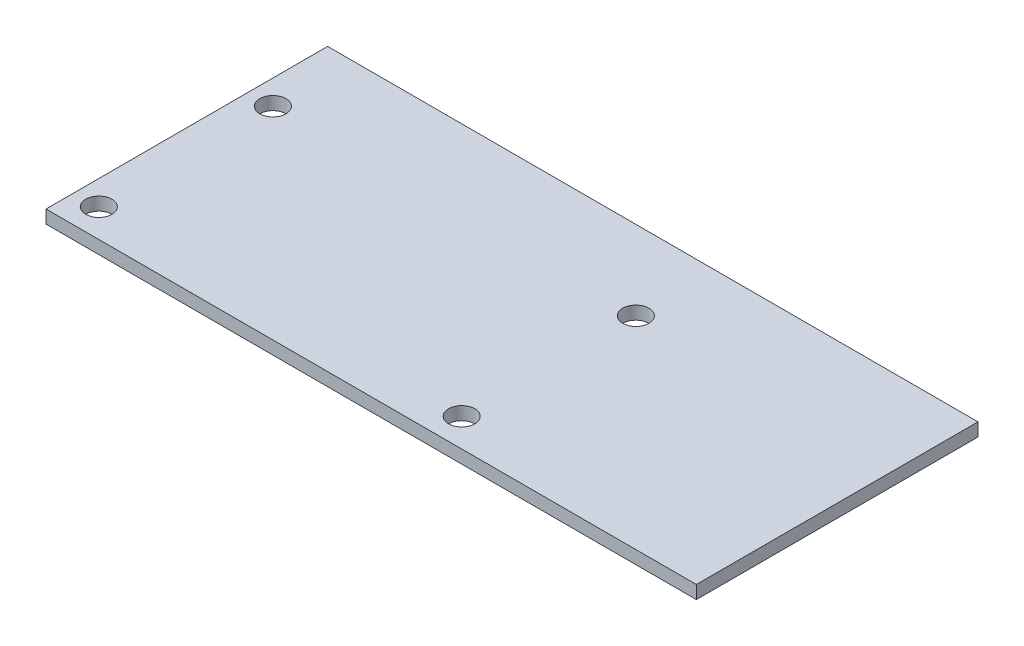
ISO-10303-21;
HEADER;
FILE_DESCRIPTION(('STEP AP214'),'2;1');
FILE_NAME('part.step','',(''),(''),'','','');
FILE_SCHEMA(('AUTOMOTIVE_DESIGN { 1 0 10303 214 1 1 1 1 }'));
ENDSEC;
DATA;
#1=APPLICATION_CONTEXT('core data for automotive mechanical design processes');
#2=APPLICATION_PROTOCOL_DEFINITION('international standard','automotive_design',2000,#1);
#3=PRODUCT_CONTEXT('',#1,'mechanical');
#4=PRODUCT('Part','Part','',(#3));
#5=PRODUCT_RELATED_PRODUCT_CATEGORY('part','',(#4));
#6=PRODUCT_DEFINITION_FORMATION('','',#4);
#7=PRODUCT_DEFINITION_CONTEXT('part definition',#1,'design');
#8=PRODUCT_DEFINITION('design','',#6,#7);
#9=PRODUCT_DEFINITION_SHAPE('','',#8);
#10=(LENGTH_UNIT() NAMED_UNIT(*) SI_UNIT(.MILLI.,.METRE.));
#11=(NAMED_UNIT(*) PLANE_ANGLE_UNIT() SI_UNIT($,.RADIAN.));
#12=(NAMED_UNIT(*) SI_UNIT($,.STERADIAN.) SOLID_ANGLE_UNIT());
#13=UNCERTAINTY_MEASURE_WITH_UNIT(LENGTH_MEASURE(1.E-05),#10,'distance_accuracy_value','');
#14=(GEOMETRIC_REPRESENTATION_CONTEXT(3) GLOBAL_UNCERTAINTY_ASSIGNED_CONTEXT((#13)) GLOBAL_UNIT_ASSIGNED_CONTEXT((#10,
#11,#12)) REPRESENTATION_CONTEXT('',''));
#15=CARTESIAN_POINT('',(0.,0.,0.));
#16=DIRECTION('',(0.,0.,1.));
#17=DIRECTION('',(1.,0.,0.));
#18=AXIS2_PLACEMENT_3D('',#15,#16,#17);
#19=CARTESIAN_POINT('',(0.,1.5875,0.));
#20=DIRECTION('',(-1.,0.,0.));
#21=DIRECTION('',(0.,0.,1.));
#22=AXIS2_PLACEMENT_3D('',#19,#20,#21);
#23=PLANE('',#22);
#24=DIRECTION('',(0.,0.,-1.));
#25=VECTOR('',#24,1.);
#26=CARTESIAN_POINT('',(0.,0.,0.));
#27=LINE('',#26,#25);
#28=CARTESIAN_POINT('',(0.,0.,0.));
#29=VERTEX_POINT('',#28);
#30=CARTESIAN_POINT('',(0.,0.,-34.0995));
#31=VERTEX_POINT('',#30);
#32=EDGE_CURVE('E111',#29,#31,#27,.T.);
#33=ORIENTED_EDGE('',*,*,#32,.F.);
#34=DIRECTION('',(0.,-1.,0.));
#35=VECTOR('',#34,1.);
#36=CARTESIAN_POINT('',(0.,1.5875,0.));
#37=LINE('',#36,#35);
#38=CARTESIAN_POINT('',(0.,1.5875,0.));
#39=VERTEX_POINT('',#38);
#40=EDGE_CURVE('E11',#39,#29,#37,.T.);
#41=ORIENTED_EDGE('',*,*,#40,.F.);
#42=DIRECTION('',(0.,0.,-1.));
#43=VECTOR('',#42,1.);
#44=CARTESIAN_POINT('',(0.,1.5875,0.));
#45=LINE('',#44,#43);
#46=CARTESIAN_POINT('',(0.,1.5875,-34.0995));
#47=VERTEX_POINT('',#46);
#48=EDGE_CURVE('E103',#39,#47,#45,.T.);
#49=ORIENTED_EDGE('',*,*,#48,.T.);
#50=DIRECTION('',(0.,-1.,0.));
#51=VECTOR('',#50,1.);
#52=CARTESIAN_POINT('',(0.,1.5875,-34.0995));
#53=LINE('',#52,#51);
#54=EDGE_CURVE('E42',#47,#31,#53,.T.);
#55=ORIENTED_EDGE('',*,*,#54,.T.);
#56=EDGE_LOOP('',(#33,#41,#49,#55));
#57=FACE_BOUND('',#56,.T.);
#58=ADVANCED_FACE('F39',(#57),#23,.T.);
#59=CARTESIAN_POINT('',(0.,1.5875,0.));
#60=DIRECTION('',(0.,0.,-1.));
#61=DIRECTION('',(-1.,0.,0.));
#62=AXIS2_PLACEMENT_3D('',#59,#60,#61);
#63=PLANE('',#62);
#64=DIRECTION('',(1.,0.,0.));
#65=VECTOR('',#64,1.);
#66=CARTESIAN_POINT('',(0.,0.,0.));
#67=LINE('',#66,#65);
#68=CARTESIAN_POINT('',(78.74,0.,0.));
#69=VERTEX_POINT('',#68);
#70=EDGE_CURVE('E73',#29,#69,#67,.T.);
#71=ORIENTED_EDGE('',*,*,#70,.T.);
#72=DIRECTION('',(0.,-1.,0.));
#73=VECTOR('',#72,1.);
#74=CARTESIAN_POINT('',(78.74,1.5875,0.));
#75=LINE('',#74,#73);
#76=CARTESIAN_POINT('',(78.74,1.5875,0.));
#77=VERTEX_POINT('',#76);
#78=EDGE_CURVE('E49',#77,#69,#75,.T.);
#79=ORIENTED_EDGE('',*,*,#78,.F.);
#80=DIRECTION('',(1.,0.,0.));
#81=VECTOR('',#80,1.);
#82=CARTESIAN_POINT('',(0.,1.5875,0.));
#83=LINE('',#82,#81);
#84=EDGE_CURVE('E90',#39,#77,#83,.T.);
#85=ORIENTED_EDGE('',*,*,#84,.F.);
#86=ORIENTED_EDGE('',*,*,#40,.T.);
#87=EDGE_LOOP('',(#71,#79,#85,#86));
#88=FACE_BOUND('',#87,.T.);
#89=ADVANCED_FACE('F128',(#88),#63,.F.);
#90=CARTESIAN_POINT('',(78.74,1.5875,0.));
#91=DIRECTION('',(-1.,0.,0.));
#92=DIRECTION('',(0.,0.,1.));
#93=AXIS2_PLACEMENT_3D('',#90,#91,#92);
#94=PLANE('',#93);
#95=DIRECTION('',(0.,0.,-1.));
#96=VECTOR('',#95,1.);
#97=CARTESIAN_POINT('',(78.74,0.,0.));
#98=LINE('',#97,#96);
#99=CARTESIAN_POINT('',(78.74,0.,-34.0995));
#100=VERTEX_POINT('',#99);
#101=EDGE_CURVE('E98',#69,#100,#98,.T.);
#102=ORIENTED_EDGE('',*,*,#101,.T.);
#103=DIRECTION('',(0.,-1.,0.));
#104=VECTOR('',#103,1.);
#105=CARTESIAN_POINT('',(78.74,1.5875,-34.0995));
#106=LINE('',#105,#104);
#107=CARTESIAN_POINT('',(78.74,1.5875,-34.0995));
#108=VERTEX_POINT('',#107);
#109=EDGE_CURVE('E95',#108,#100,#106,.T.);
#110=ORIENTED_EDGE('',*,*,#109,.F.);
#111=DIRECTION('',(0.,0.,-1.));
#112=VECTOR('',#111,1.);
#113=CARTESIAN_POINT('',(78.74,1.5875,0.));
#114=LINE('',#113,#112);
#115=EDGE_CURVE('E85',#77,#108,#114,.T.);
#116=ORIENTED_EDGE('',*,*,#115,.F.);
#117=ORIENTED_EDGE('',*,*,#78,.T.);
#118=EDGE_LOOP('',(#102,#110,#116,#117));
#119=FACE_BOUND('',#118,.T.);
#120=ADVANCED_FACE('F96',(#119),#94,.F.);
#121=CARTESIAN_POINT('',(0.,1.5875,-34.0995));
#122=DIRECTION('',(0.,0.,-1.));
#123=DIRECTION('',(-1.,0.,0.));
#124=AXIS2_PLACEMENT_3D('',#121,#122,#123);
#125=PLANE('',#124);
#126=DIRECTION('',(1.,0.,0.));
#127=VECTOR('',#126,1.);
#128=CARTESIAN_POINT('',(0.,0.,-34.0995));
#129=LINE('',#128,#127);
#130=EDGE_CURVE('E115',#31,#100,#129,.T.);
#131=ORIENTED_EDGE('',*,*,#130,.F.);
#132=ORIENTED_EDGE('',*,*,#54,.F.);
#133=DIRECTION('',(1.,0.,0.));
#134=VECTOR('',#133,1.);
#135=CARTESIAN_POINT('',(0.,1.5875,-34.0995));
#136=LINE('',#135,#134);
#137=EDGE_CURVE('E89',#47,#108,#136,.T.);
#138=ORIENTED_EDGE('',*,*,#137,.T.);
#139=ORIENTED_EDGE('',*,*,#109,.T.);
#140=EDGE_LOOP('',(#131,#132,#138,#139));
#141=FACE_BOUND('',#140,.T.);
#142=ADVANCED_FACE('F101',(#141),#125,.T.);
#143=CARTESIAN_POINT('',(0.,1.5875,0.));
#144=DIRECTION('',(0.,-1.,0.));
#145=DIRECTION('',(0.,0.,-1.));
#146=AXIS2_PLACEMENT_3D('',#143,#144,#145);
#147=PLANE('',#146);
#148=CARTESIAN_POINT('',(46.9011,1.5875,-24.511));
#149=DIRECTION('',(0.,1.,0.));
#150=DIRECTION('',(0.,0.,1.));
#151=AXIS2_PLACEMENT_3D('',#148,#149,#150);
#152=CIRCLE('',#151,1.5875);
#153=CARTESIAN_POINT('',(46.9011,1.5875,-22.9235));
#154=VERTEX_POINT('',#153);
#155=EDGE_CURVE('E187',#154,#154,#152,.T.);
#156=ORIENTED_EDGE('',*,*,#155,.F.);
#157=EDGE_LOOP('',(#156));
#158=FACE_BOUND('',#157,.T.);
#159=CARTESIAN_POINT('',(2.9591,1.5875,-3.429));
#160=DIRECTION('',(0.,1.,0.));
#161=DIRECTION('',(0.,0.,1.));
#162=AXIS2_PLACEMENT_3D('',#159,#160,#161);
#163=CIRCLE('',#162,1.5875);
#164=CARTESIAN_POINT('',(2.9591,1.5875,-1.8415));
#165=VERTEX_POINT('',#164);
#166=EDGE_CURVE('E179',#165,#165,#163,.T.);
#167=ORIENTED_EDGE('',*,*,#166,.F.);
#168=EDGE_LOOP('',(#167));
#169=FACE_BOUND('',#168,.T.);
#170=CARTESIAN_POINT('',(46.9011,1.5875,-3.429));
#171=DIRECTION('',(0.,1.,0.));
#172=DIRECTION('',(0.,0.,1.));
#173=AXIS2_PLACEMENT_3D('',#170,#171,#172);
#174=CIRCLE('',#173,1.5875);
#175=CARTESIAN_POINT('',(46.9011,1.5875,-1.8415));
#176=VERTEX_POINT('',#175);
#177=EDGE_CURVE('E174',#176,#176,#174,.T.);
#178=ORIENTED_EDGE('',*,*,#177,.F.);
#179=EDGE_LOOP('',(#178));
#180=FACE_BOUND('',#179,.T.);
#181=CARTESIAN_POINT('',(2.9591,1.5875,-24.511));
#182=DIRECTION('',(0.,1.,0.));
#183=DIRECTION('',(0.,0.,1.));
#184=AXIS2_PLACEMENT_3D('',#181,#182,#183);
#185=CIRCLE('',#184,1.5875);
#186=CARTESIAN_POINT('',(2.9591,1.5875,-22.9235));
#187=VERTEX_POINT('',#186);
#188=EDGE_CURVE('E186',#187,#187,#185,.T.);
#189=ORIENTED_EDGE('',*,*,#188,.F.);
#190=EDGE_LOOP('',(#189));
#191=FACE_BOUND('',#190,.T.);
#192=ORIENTED_EDGE('',*,*,#48,.F.);
#193=ORIENTED_EDGE('',*,*,#84,.T.);
#194=ORIENTED_EDGE('',*,*,#115,.T.);
#195=ORIENTED_EDGE('',*,*,#137,.F.);
#196=EDGE_LOOP('',(#192,#193,#194,#195));
#197=FACE_BOUND('',#196,.T.);
#198=ADVANCED_FACE('F88',(#158,#169,#180,#191,#197),#147,.F.);
#199=CARTESIAN_POINT('',(0.,0.,0.));
#200=DIRECTION('',(0.,-1.,0.));
#201=DIRECTION('',(0.,0.,-1.));
#202=AXIS2_PLACEMENT_3D('',#199,#200,#201);
#203=PLANE('',#202);
#204=CARTESIAN_POINT('',(46.9011,0.,-24.511));
#205=DIRECTION('',(0.,1.,0.));
#206=DIRECTION('',(0.,0.,1.));
#207=AXIS2_PLACEMENT_3D('',#204,#205,#206);
#208=CIRCLE('',#207,1.5875);
#209=CARTESIAN_POINT('',(46.9011,0.,-22.9235));
#210=VERTEX_POINT('',#209);
#211=EDGE_CURVE('E182',#210,#210,#208,.T.);
#212=ORIENTED_EDGE('',*,*,#211,.T.);
#213=EDGE_LOOP('',(#212));
#214=FACE_BOUND('',#213,.T.);
#215=CARTESIAN_POINT('',(2.9591,0.,-3.429));
#216=DIRECTION('',(0.,1.,0.));
#217=DIRECTION('',(0.,0.,1.));
#218=AXIS2_PLACEMENT_3D('',#215,#216,#217);
#219=CIRCLE('',#218,1.5875);
#220=CARTESIAN_POINT('',(2.9591,0.,-1.8415));
#221=VERTEX_POINT('',#220);
#222=EDGE_CURVE('E191',#221,#221,#219,.T.);
#223=ORIENTED_EDGE('',*,*,#222,.T.);
#224=EDGE_LOOP('',(#223));
#225=FACE_BOUND('',#224,.T.);
#226=CARTESIAN_POINT('',(46.9011,0.,-3.429));
#227=DIRECTION('',(0.,1.,0.));
#228=DIRECTION('',(0.,0.,1.));
#229=AXIS2_PLACEMENT_3D('',#226,#227,#228);
#230=CIRCLE('',#229,1.5875);
#231=CARTESIAN_POINT('',(46.9011,0.,-1.8415));
#232=VERTEX_POINT('',#231);
#233=EDGE_CURVE('E171',#232,#232,#230,.T.);
#234=ORIENTED_EDGE('',*,*,#233,.T.);
#235=EDGE_LOOP('',(#234));
#236=FACE_BOUND('',#235,.T.);
#237=CARTESIAN_POINT('',(2.9591,0.,-24.511));
#238=DIRECTION('',(0.,1.,0.));
#239=DIRECTION('',(0.,0.,1.));
#240=AXIS2_PLACEMENT_3D('',#237,#238,#239);
#241=CIRCLE('',#240,1.5875);
#242=CARTESIAN_POINT('',(2.9591,0.,-22.9235));
#243=VERTEX_POINT('',#242);
#244=EDGE_CURVE('E116',#243,#243,#241,.T.);
#245=ORIENTED_EDGE('',*,*,#244,.T.);
#246=EDGE_LOOP('',(#245));
#247=FACE_BOUND('',#246,.T.);
#248=ORIENTED_EDGE('',*,*,#32,.T.);
#249=ORIENTED_EDGE('',*,*,#130,.T.);
#250=ORIENTED_EDGE('',*,*,#101,.F.);
#251=ORIENTED_EDGE('',*,*,#70,.F.);
#252=EDGE_LOOP('',(#248,#249,#250,#251));
#253=FACE_BOUND('',#252,.T.);
#254=ADVANCED_FACE('F125',(#214,#225,#236,#247,#253),#203,.T.);
#255=CARTESIAN_POINT('',(2.9591,0.,-24.511));
#256=DIRECTION('',(0.,1.,0.));
#257=DIRECTION('',(0.,0.,1.));
#258=AXIS2_PLACEMENT_3D('',#255,#256,#257);
#259=CYLINDRICAL_SURFACE('',#258,1.5875);
#260=ORIENTED_EDGE('',*,*,#244,.F.);
#261=EDGE_LOOP('',(#260));
#262=FACE_BOUND('',#261,.T.);
#263=ORIENTED_EDGE('',*,*,#188,.T.);
#264=EDGE_LOOP('',(#263));
#265=FACE_BOUND('',#264,.T.);
#266=ADVANCED_FACE('F147',(#262,#265),#259,.F.);
#267=CARTESIAN_POINT('',(46.9011,0.,-3.429));
#268=DIRECTION('',(0.,1.,0.));
#269=DIRECTION('',(0.,0.,1.));
#270=AXIS2_PLACEMENT_3D('',#267,#268,#269);
#271=CYLINDRICAL_SURFACE('',#270,1.5875);
#272=ORIENTED_EDGE('',*,*,#233,.F.);
#273=EDGE_LOOP('',(#272));
#274=FACE_BOUND('',#273,.T.);
#275=ORIENTED_EDGE('',*,*,#177,.T.);
#276=EDGE_LOOP('',(#275));
#277=FACE_BOUND('',#276,.T.);
#278=ADVANCED_FACE('F154',(#274,#277),#271,.F.);
#279=CARTESIAN_POINT('',(2.9591,0.,-3.429));
#280=DIRECTION('',(0.,1.,0.));
#281=DIRECTION('',(0.,0.,1.));
#282=AXIS2_PLACEMENT_3D('',#279,#280,#281);
#283=CYLINDRICAL_SURFACE('',#282,1.5875);
#284=ORIENTED_EDGE('',*,*,#222,.F.);
#285=EDGE_LOOP('',(#284));
#286=FACE_BOUND('',#285,.T.);
#287=ORIENTED_EDGE('',*,*,#166,.T.);
#288=EDGE_LOOP('',(#287));
#289=FACE_BOUND('',#288,.T.);
#290=ADVANCED_FACE('F156',(#286,#289),#283,.F.);
#291=CARTESIAN_POINT('',(46.9011,0.,-24.511));
#292=DIRECTION('',(0.,1.,0.));
#293=DIRECTION('',(0.,0.,1.));
#294=AXIS2_PLACEMENT_3D('',#291,#292,#293);
#295=CYLINDRICAL_SURFACE('',#294,1.5875);
#296=ORIENTED_EDGE('',*,*,#211,.F.);
#297=EDGE_LOOP('',(#296));
#298=FACE_BOUND('',#297,.T.);
#299=ORIENTED_EDGE('',*,*,#155,.T.);
#300=EDGE_LOOP('',(#299));
#301=FACE_BOUND('',#300,.T.);
#302=ADVANCED_FACE('F159',(#298,#301),#295,.F.);
#303=CLOSED_SHELL('',(#58,#89,#120,#142,#198,#254,#266,#278,#290,#302));
#304=MANIFOLD_SOLID_BREP('B2',#303);
#305=ADVANCED_BREP_SHAPE_REPRESENTATION('',(#18,#304),#14);
#306=SHAPE_DEFINITION_REPRESENTATION(#9,#305);
ENDSEC;
END-ISO-10303-21;
